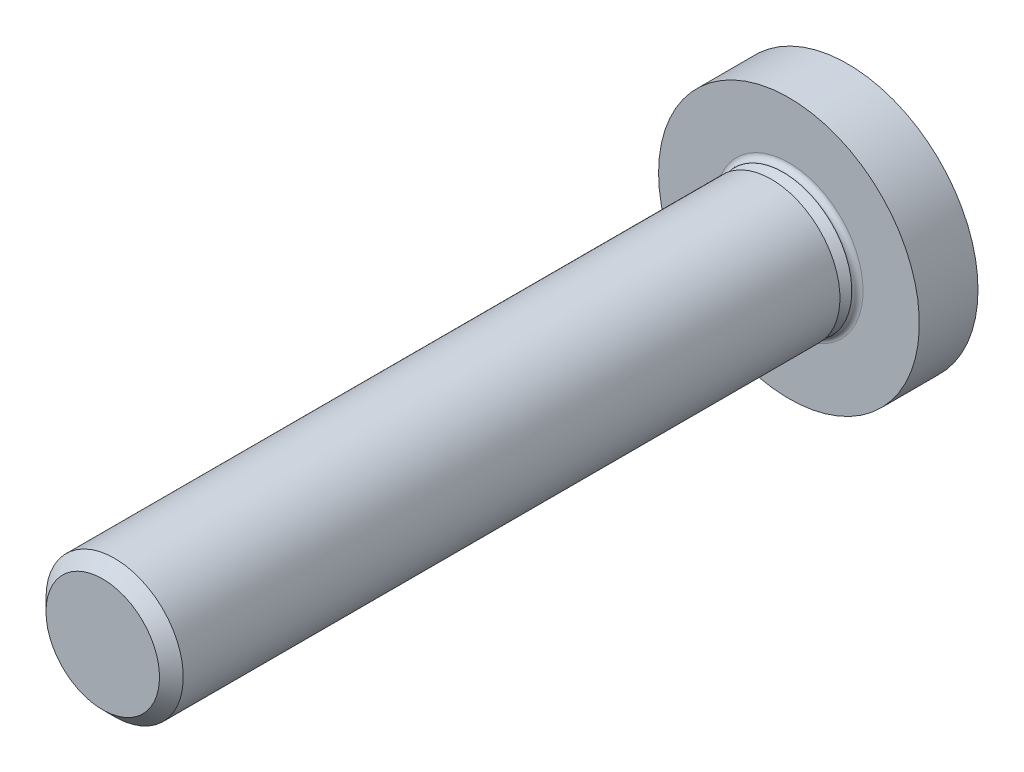
ISO-10303-21;
HEADER;
FILE_DESCRIPTION(('STEP AP214'),'2;1');
FILE_NAME('part.step','',(''),(''),'','','');
FILE_SCHEMA(('AUTOMOTIVE_DESIGN { 1 0 10303 214 1 1 1 1 }'));
ENDSEC;
DATA;
#1=APPLICATION_CONTEXT('core data for automotive mechanical design processes');
#2=APPLICATION_PROTOCOL_DEFINITION('international standard','automotive_design',2000,#1);
#3=PRODUCT_CONTEXT('',#1,'mechanical');
#4=PRODUCT('Part','Part','',(#3));
#5=PRODUCT_RELATED_PRODUCT_CATEGORY('part','',(#4));
#6=PRODUCT_DEFINITION_FORMATION('','',#4);
#7=PRODUCT_DEFINITION_CONTEXT('part definition',#1,'design');
#8=PRODUCT_DEFINITION('design','',#6,#7);
#9=PRODUCT_DEFINITION_SHAPE('','',#8);
#10=(LENGTH_UNIT() NAMED_UNIT(*) SI_UNIT(.MILLI.,.METRE.));
#11=(NAMED_UNIT(*) PLANE_ANGLE_UNIT() SI_UNIT($,.RADIAN.));
#12=(NAMED_UNIT(*) SI_UNIT($,.STERADIAN.) SOLID_ANGLE_UNIT());
#13=UNCERTAINTY_MEASURE_WITH_UNIT(LENGTH_MEASURE(1.E-05),#10,'distance_accuracy_value','');
#14=(GEOMETRIC_REPRESENTATION_CONTEXT(3) GLOBAL_UNCERTAINTY_ASSIGNED_CONTEXT((#13)) GLOBAL_UNIT_ASSIGNED_CONTEXT((#10,
#11,#12)) REPRESENTATION_CONTEXT('',''));
#15=CARTESIAN_POINT('',(0.,0.,0.));
#16=DIRECTION('',(0.,0.,1.));
#17=DIRECTION('',(1.,0.,0.));
#18=AXIS2_PLACEMENT_3D('',#15,#16,#17);
#19=CARTESIAN_POINT('',(0.,0.,8.));
#20=DIRECTION('',(0.,0.,-1.));
#21=DIRECTION('',(0.,1.,0.));
#22=AXIS2_PLACEMENT_3D('',#19,#20,#21);
#23=SPHERICAL_SURFACE('',#22,8.);
#24=CARTESIAN_POINT('',(0.,0.,1.56280340520813));
#25=DIRECTION('',(0.,0.,-1.));
#26=DIRECTION('',(-1.,0.,0.));
#27=AXIS2_PLACEMENT_3D('',#24,#25,#26);
#28=CIRCLE('',#27,4.75);
#29=CARTESIAN_POINT('',(-4.75,0.,1.56280340520814));
#30=VERTEX_POINT('',#29);
#31=EDGE_CURVE('E167',#30,#30,#28,.T.);
#32=ORIENTED_EDGE('',*,*,#31,.T.);
#33=EDGE_LOOP('',(#32));
#34=FACE_BOUND('',#33,.T.);
#35=CARTESIAN_POINT('',(-0.624137544363258,0.291040116678642,7.81547422038059));
#36=DIRECTION('',(-0.875426098065593,0.408217893676735,-0.258819045102521));
#37=DIRECTION('',(-0.422618261740699,-0.90630778703665,0.));
#38=AXIS2_PLACEMENT_3D('',#35,#36,#37);
#39=CIRCLE('',#38,7.96816780777462);
#40=CARTESIAN_POINT('',(1.03061730474433,-1.03061730474433,0.133891944403316));
#41=VERTEX_POINT('',#40);
#42=CARTESIAN_POINT('',(0.346582563727334,-2.35307070757356,0.361745044077184));
#43=VERTEX_POINT('',#42);
#44=EDGE_CURVE('E11',#41,#43,#39,.T.);
#45=ORIENTED_EDGE('',*,*,#44,.F.);
#46=CARTESIAN_POINT('',(-0.291040116678642,0.624137544363259,7.81547422038059));
#47=DIRECTION('',(-0.408217893676735,0.875426098065593,-0.258819045102521));
#48=DIRECTION('',(-0.90630778703665,-0.422618261740699,0.));
#49=AXIS2_PLACEMENT_3D('',#46,#47,#48);
#50=CIRCLE('',#49,7.96816780777462);
#51=CARTESIAN_POINT('',(2.35307070757356,-0.346582563727334,0.361745044077183));
#52=VERTEX_POINT('',#51);
#53=EDGE_CURVE('E25',#52,#41,#50,.T.);
#54=ORIENTED_EDGE('',*,*,#53,.F.);
#55=CARTESIAN_POINT('',(0.285881119635937,0.,8.07660161513776));
#56=DIRECTION('',(-0.965925826289068,0.,-0.258819045102521));
#57=DIRECTION('',(-0.258819045102521,0.,0.965925826289068));
#58=AXIS2_PLACEMENT_3D('',#55,#56,#57);
#59=CIRCLE('',#58,7.99452338654369);
#60=CARTESIAN_POINT('',(2.35307070757356,0.346582563727333,0.361745044077182));
#61=VERTEX_POINT('',#60);
#62=EDGE_CURVE('E230',#61,#52,#59,.T.);
#63=ORIENTED_EDGE('',*,*,#62,.F.);
#64=CARTESIAN_POINT('',(-0.291040116678642,-0.624137544363258,7.81547422038059));
#65=DIRECTION('',(-0.408217893676735,-0.875426098065593,-0.258819045102521));
#66=DIRECTION('',(0.90630778703665,-0.4226182617407,0.));
#67=AXIS2_PLACEMENT_3D('',#64,#65,#66);
#68=CIRCLE('',#67,7.96816780777462);
#69=CARTESIAN_POINT('',(1.03061730474433,1.03061730474433,0.133891944403315));
#70=VERTEX_POINT('',#69);
#71=EDGE_CURVE('E227',#70,#61,#68,.T.);
#72=ORIENTED_EDGE('',*,*,#71,.F.);
#73=CARTESIAN_POINT('',(-0.624137544363257,-0.291040116678642,7.81547422038059));
#74=DIRECTION('',(-0.875426098065593,-0.408217893676735,-0.258819045102521));
#75=DIRECTION('',(0.4226182617407,-0.90630778703665,0.));
#76=AXIS2_PLACEMENT_3D('',#73,#74,#75);
#77=CIRCLE('',#76,7.96816780777462);
#78=CARTESIAN_POINT('',(0.346582563727334,2.35307070757356,0.361745044077184));
#79=VERTEX_POINT('',#78);
#80=EDGE_CURVE('E224',#79,#70,#77,.T.);
#81=ORIENTED_EDGE('',*,*,#80,.F.);
#82=CARTESIAN_POINT('',(0.,0.285881119635937,8.07660161513776));
#83=DIRECTION('',(0.,-0.965925826289068,-0.258819045102521));
#84=DIRECTION('',(0.,0.258819045102521,-0.965925826289068));
#85=AXIS2_PLACEMENT_3D('',#82,#83,#84);
#86=CIRCLE('',#85,7.99452338654369);
#87=CARTESIAN_POINT('',(-0.346582563727333,2.35307070757356,0.361745044077183));
#88=VERTEX_POINT('',#87);
#89=EDGE_CURVE('E221',#88,#79,#86,.T.);
#90=ORIENTED_EDGE('',*,*,#89,.F.);
#91=CARTESIAN_POINT('',(0.624137544363259,-0.291040116678642,7.81547422038059));
#92=DIRECTION('',(0.875426098065593,-0.408217893676735,-0.258819045102521));
#93=DIRECTION('',(0.422618261740699,0.90630778703665,0.));
#94=AXIS2_PLACEMENT_3D('',#91,#92,#93);
#95=CIRCLE('',#94,7.96816780777462);
#96=CARTESIAN_POINT('',(-1.03061730474433,1.03061730474433,0.133891944403315));
#97=VERTEX_POINT('',#96);
#98=EDGE_CURVE('E218',#97,#88,#95,.T.);
#99=ORIENTED_EDGE('',*,*,#98,.F.);
#100=CARTESIAN_POINT('',(0.291040116678642,-0.624137544363258,7.81547422038059));
#101=DIRECTION('',(0.408217893676735,-0.875426098065593,-0.258819045102521));
#102=DIRECTION('',(0.90630778703665,0.422618261740699,0.));
#103=AXIS2_PLACEMENT_3D('',#100,#101,#102);
#104=CIRCLE('',#103,7.96816780777462);
#105=CARTESIAN_POINT('',(-2.35307070757356,0.346582563727334,0.361745044077184));
#106=VERTEX_POINT('',#105);
#107=EDGE_CURVE('E215',#106,#97,#104,.T.);
#108=ORIENTED_EDGE('',*,*,#107,.F.);
#109=CARTESIAN_POINT('',(-0.285881119635938,0.,8.07660161513776));
#110=DIRECTION('',(0.965925826289068,0.,-0.258819045102521));
#111=DIRECTION('',(-0.258819045102521,0.,-0.965925826289068));
#112=AXIS2_PLACEMENT_3D('',#109,#110,#111);
#113=CIRCLE('',#112,7.99452338654369);
#114=CARTESIAN_POINT('',(-2.35307070757356,-0.346582563727333,0.361745044077184));
#115=VERTEX_POINT('',#114);
#116=EDGE_CURVE('E212',#115,#106,#113,.T.);
#117=ORIENTED_EDGE('',*,*,#116,.F.);
#118=CARTESIAN_POINT('',(0.291040116678643,0.624137544363258,7.81547422038059));
#119=DIRECTION('',(0.408217893676735,0.875426098065593,-0.258819045102521));
#120=DIRECTION('',(-0.90630778703665,0.422618261740699,0.));
#121=AXIS2_PLACEMENT_3D('',#118,#119,#120);
#122=CIRCLE('',#121,7.96816780777462);
#123=CARTESIAN_POINT('',(-1.03061730474433,-1.03061730474433,0.133891944403315));
#124=VERTEX_POINT('',#123);
#125=EDGE_CURVE('E209',#124,#115,#122,.T.);
#126=ORIENTED_EDGE('',*,*,#125,.F.);
#127=CARTESIAN_POINT('',(0.624137544363258,0.291040116678642,7.81547422038059));
#128=DIRECTION('',(0.875426098065593,0.408217893676735,-0.258819045102521));
#129=DIRECTION('',(-0.422618261740699,0.90630778703665,0.));
#130=AXIS2_PLACEMENT_3D('',#127,#128,#129);
#131=CIRCLE('',#130,7.96816780777462);
#132=CARTESIAN_POINT('',(-0.346582563727334,-2.35307070757356,0.361745044077183));
#133=VERTEX_POINT('',#132);
#134=EDGE_CURVE('E206',#133,#124,#131,.T.);
#135=ORIENTED_EDGE('',*,*,#134,.F.);
#136=CARTESIAN_POINT('',(0.,-0.285881119635937,8.07660161513776));
#137=DIRECTION('',(0.,0.965925826289068,-0.258819045102521));
#138=DIRECTION('',(0.,0.258819045102521,0.965925826289068));
#139=AXIS2_PLACEMENT_3D('',#136,#137,#138);
#140=CIRCLE('',#139,7.99452338654369);
#141=EDGE_CURVE('E203',#43,#133,#140,.T.);
#142=ORIENTED_EDGE('',*,*,#141,.F.);
#143=EDGE_LOOP('',(#45,#54,#63,#72,#81,#90,#99,#108,#117,#126,#135,#142));
#144=FACE_BOUND('',#143,.T.);
#145=ADVANCED_FACE('F16',(#34,#144),#23,.T.);
#146=CARTESIAN_POINT('',(0.,0.,28.7));
#147=DIRECTION('',(0.,0.,-1.));
#148=DIRECTION('',(-1.,0.,0.));
#149=AXIS2_PLACEMENT_3D('',#146,#147,#148);
#150=PLANE('',#149);
#151=CARTESIAN_POINT('',(0.,0.,28.7));
#152=DIRECTION('',(0.,0.,-1.));
#153=DIRECTION('',(-1.,0.,0.));
#154=AXIS2_PLACEMENT_3D('',#151,#152,#153);
#155=CIRCLE('',#154,2.067);
#156=CARTESIAN_POINT('',(-2.067,0.,28.7));
#157=VERTEX_POINT('',#156);
#158=EDGE_CURVE('E199',#157,#157,#155,.T.);
#159=ORIENTED_EDGE('',*,*,#158,.F.);
#160=EDGE_LOOP('',(#159));
#161=FACE_BOUND('',#160,.T.);
#162=ADVANCED_FACE('F18',(#161),#150,.F.);
#163=CARTESIAN_POINT('',(0.,0.,28.7));
#164=DIRECTION('',(0.,0.,-1.));
#165=DIRECTION('',(-1.,0.,0.));
#166=AXIS2_PLACEMENT_3D('',#163,#164,#165);
#167=CONICAL_SURFACE('',#166,2.067,0.785398163397449);
#168=CARTESIAN_POINT('',(0.,0.,28.267));
#169=DIRECTION('',(0.,0.,-1.));
#170=DIRECTION('',(-1.,0.,0.));
#171=AXIS2_PLACEMENT_3D('',#168,#169,#170);
#172=CIRCLE('',#171,2.5);
#173=CARTESIAN_POINT('',(-2.5,0.,28.267));
#174=VERTEX_POINT('',#173);
#175=EDGE_CURVE('E195',#174,#174,#172,.T.);
#176=ORIENTED_EDGE('',*,*,#175,.F.);
#177=EDGE_LOOP('',(#176));
#178=FACE_BOUND('',#177,.T.);
#179=ORIENTED_EDGE('',*,*,#158,.T.);
#180=EDGE_LOOP('',(#179));
#181=FACE_BOUND('',#180,.T.);
#182=ADVANCED_FACE('F251',(#178,#181),#167,.T.);
#183=CARTESIAN_POINT('',(0.,0.,0.));
#184=DIRECTION('',(0.,0.,-1.));
#185=DIRECTION('',(-1.,0.,0.));
#186=AXIS2_PLACEMENT_3D('',#183,#184,#185);
#187=CYLINDRICAL_SURFACE('',#186,2.5);
#188=CARTESIAN_POINT('',(0.,0.,4.343));
#189=DIRECTION('',(0.,0.,-1.));
#190=DIRECTION('',(-1.,0.,0.));
#191=AXIS2_PLACEMENT_3D('',#188,#189,#190);
#192=CIRCLE('',#191,2.5);
#193=CARTESIAN_POINT('',(-2.5,0.,4.343));
#194=VERTEX_POINT('',#193);
#195=EDGE_CURVE('E191',#194,#194,#192,.T.);
#196=ORIENTED_EDGE('',*,*,#195,.F.);
#197=EDGE_LOOP('',(#196));
#198=FACE_BOUND('',#197,.T.);
#199=ORIENTED_EDGE('',*,*,#175,.T.);
#200=EDGE_LOOP('',(#199));
#201=FACE_BOUND('',#200,.T.);
#202=ADVANCED_FACE('F263',(#198,#201),#187,.T.);
#203=CARTESIAN_POINT('',(0.,2.5,4.343));
#204=DIRECTION('',(0.,0.,1.));
#205=DIRECTION('',(1.,0.,0.));
#206=AXIS2_PLACEMENT_3D('',#203,#204,#205);
#207=PLANE('',#206);
#208=CARTESIAN_POINT('',(0.,0.,4.343));
#209=DIRECTION('',(0.,0.,-1.));
#210=DIRECTION('',(-1.,0.,0.));
#211=AXIS2_PLACEMENT_3D('',#208,#209,#210);
#212=CIRCLE('',#211,2.067);
#213=CARTESIAN_POINT('',(-2.067,0.,4.343));
#214=VERTEX_POINT('',#213);
#215=EDGE_CURVE('E187',#214,#214,#212,.T.);
#216=ORIENTED_EDGE('',*,*,#215,.F.);
#217=EDGE_LOOP('',(#216));
#218=FACE_BOUND('',#217,.T.);
#219=ORIENTED_EDGE('',*,*,#195,.T.);
#220=EDGE_LOOP('',(#219));
#221=FACE_BOUND('',#220,.T.);
#222=ADVANCED_FACE('F273',(#218,#221),#207,.F.);
#223=CARTESIAN_POINT('',(0.,0.,4.343));
#224=DIRECTION('',(0.,0.,-1.));
#225=DIRECTION('',(-1.,0.,0.));
#226=AXIS2_PLACEMENT_3D('',#223,#224,#225);
#227=CONICAL_SURFACE('',#226,2.067,0.785398163397448);
#228=CARTESIAN_POINT('',(0.,0.,3.91));
#229=DIRECTION('',(0.,0.,-1.));
#230=DIRECTION('',(-1.,0.,0.));
#231=AXIS2_PLACEMENT_3D('',#228,#229,#230);
#232=CIRCLE('',#231,2.5);
#233=CARTESIAN_POINT('',(-2.5,0.,3.91));
#234=VERTEX_POINT('',#233);
#235=EDGE_CURVE('E183',#234,#234,#232,.T.);
#236=ORIENTED_EDGE('',*,*,#235,.F.);
#237=EDGE_LOOP('',(#236));
#238=FACE_BOUND('',#237,.T.);
#239=ORIENTED_EDGE('',*,*,#215,.T.);
#240=EDGE_LOOP('',(#239));
#241=FACE_BOUND('',#240,.T.);
#242=ADVANCED_FACE('F284',(#238,#241),#227,.T.);
#243=CARTESIAN_POINT('',(0.,0.,0.));
#244=DIRECTION('',(0.,0.,-1.));
#245=DIRECTION('',(-1.,0.,0.));
#246=AXIS2_PLACEMENT_3D('',#243,#244,#245);
#247=CYLINDRICAL_SURFACE('',#246,2.5);
#248=CARTESIAN_POINT('',(0.,0.,3.9));
#249=DIRECTION('',(0.,0.,-1.));
#250=DIRECTION('',(-1.,0.,0.));
#251=AXIS2_PLACEMENT_3D('',#248,#249,#250);
#252=CIRCLE('',#251,2.5);
#253=CARTESIAN_POINT('',(-2.5,0.,3.9));
#254=VERTEX_POINT('',#253);
#255=EDGE_CURVE('E179',#254,#254,#252,.T.);
#256=ORIENTED_EDGE('',*,*,#255,.F.);
#257=EDGE_LOOP('',(#256));
#258=FACE_BOUND('',#257,.T.);
#259=ORIENTED_EDGE('',*,*,#235,.T.);
#260=EDGE_LOOP('',(#259));
#261=FACE_BOUND('',#260,.T.);
#262=ADVANCED_FACE('F295',(#258,#261),#247,.T.);
#263=CARTESIAN_POINT('',(0.,0.,3.9));
#264=DIRECTION('',(0.,0.,-1.));
#265=DIRECTION('',(-1.,0.,0.));
#266=AXIS2_PLACEMENT_3D('',#263,#264,#265);
#267=TOROIDAL_SURFACE('',#266,2.7,0.2);
#268=ORIENTED_EDGE('',*,*,#255,.T.);
#269=EDGE_LOOP('',(#268));
#270=FACE_BOUND('',#269,.T.);
#271=CARTESIAN_POINT('',(0.,0.,3.7));
#272=DIRECTION('',(0.,0.,-1.));
#273=DIRECTION('',(-1.,0.,0.));
#274=AXIS2_PLACEMENT_3D('',#271,#272,#273);
#275=CIRCLE('',#274,2.7);
#276=CARTESIAN_POINT('',(-2.7,0.,3.7));
#277=VERTEX_POINT('',#276);
#278=EDGE_CURVE('E175',#277,#277,#275,.T.);
#279=ORIENTED_EDGE('',*,*,#278,.F.);
#280=EDGE_LOOP('',(#279));
#281=FACE_BOUND('',#280,.T.);
#282=ADVANCED_FACE('F306',(#270,#281),#267,.F.);
#283=CARTESIAN_POINT('',(0.,2.7,3.7));
#284=DIRECTION('',(0.,0.,-1.));
#285=DIRECTION('',(-1.,0.,0.));
#286=AXIS2_PLACEMENT_3D('',#283,#284,#285);
#287=PLANE('',#286);
#288=CARTESIAN_POINT('',(0.,0.,3.7));
#289=DIRECTION('',(0.,0.,-1.));
#290=DIRECTION('',(-1.,0.,0.));
#291=AXIS2_PLACEMENT_3D('',#288,#289,#290);
#292=CIRCLE('',#291,4.75);
#293=CARTESIAN_POINT('',(-4.75,0.,3.7));
#294=VERTEX_POINT('',#293);
#295=EDGE_CURVE('E171',#294,#294,#292,.T.);
#296=ORIENTED_EDGE('',*,*,#295,.F.);
#297=EDGE_LOOP('',(#296));
#298=FACE_BOUND('',#297,.T.);
#299=ORIENTED_EDGE('',*,*,#278,.T.);
#300=EDGE_LOOP('',(#299));
#301=FACE_BOUND('',#300,.T.);
#302=ADVANCED_FACE('F317',(#298,#301),#287,.F.);
#303=CARTESIAN_POINT('',(0.,0.,0.));
#304=DIRECTION('',(0.,0.,-1.));
#305=DIRECTION('',(-1.,0.,0.));
#306=AXIS2_PLACEMENT_3D('',#303,#304,#305);
#307=CYLINDRICAL_SURFACE('',#306,4.75);
#308=ORIENTED_EDGE('',*,*,#31,.F.);
#309=EDGE_LOOP('',(#308));
#310=FACE_BOUND('',#309,.T.);
#311=ORIENTED_EDGE('',*,*,#295,.T.);
#312=EDGE_LOOP('',(#311));
#313=FACE_BOUND('',#312,.T.);
#314=ADVANCED_FACE('F328',(#310,#313),#307,.T.);
#315=CARTESIAN_POINT('',(0.408333333333333,-2.45,0.));
#316=DIRECTION('',(-0.875426098065593,0.408217893676735,-0.258819045102521));
#317=DIRECTION('',(-0.422618261740699,-0.90630778703665,0.));
#318=AXIS2_PLACEMENT_3D('',#315,#316,#317);
#319=PLANE('',#318);
#320=ORIENTED_EDGE('',*,*,#44,.T.);
#321=DIRECTION('',(0.162689201767992,-0.255370893567974,-0.953057149569945));
#322=VECTOR('',#321,1.);
#323=CARTESIAN_POINT('',(0.408333333333333,-2.45,0.));
#324=LINE('',#323,#322);
#325=CARTESIAN_POINT('',(0.,-1.80904505601036,2.39207641633181));
#326=VERTEX_POINT('',#325);
#327=EDGE_CURVE('E32',#326,#43,#324,.T.);
#328=ORIENTED_EDGE('',*,*,#327,.F.);
#329=DIRECTION('',(0.,-0.535467009821226,-0.844556144606808));
#330=VECTOR('',#329,1.);
#331=CARTESIAN_POINT('',(0.,-3.07459620054544,0.396007609425984));
#332=LINE('',#331,#330);
#333=CARTESIAN_POINT('',(0.,-1.80402133120418,2.4));
#334=VERTEX_POINT('',#333);
#335=EDGE_CURVE('E111',#334,#326,#332,.T.);
#336=ORIENTED_EDGE('',*,*,#335,.F.);
#337=DIRECTION('',(0.422618261740699,0.90630778703665,0.));
#338=VECTOR('',#337,1.);
#339=CARTESIAN_POINT('',(0.0969943394144161,-1.59601629907971,2.4));
#340=LINE('',#339,#338);
#341=CARTESIAN_POINT('',(0.573705632332283,-0.573705632332282,2.4));
#342=VERTEX_POINT('',#341);
#343=EDGE_CURVE('E106',#334,#342,#340,.T.);
#344=ORIENTED_EDGE('',*,*,#343,.T.);
#345=DIRECTION('',(0.193899607686987,-0.193899607686987,-0.961668281829896));
#346=VECTOR('',#345,1.);
#347=CARTESIAN_POINT('',(1.08555231451638,-1.08555231451638,-0.138564803137273));
#348=LINE('',#347,#346);
#349=EDGE_CURVE('E109',#342,#41,#348,.T.);
#350=ORIENTED_EDGE('',*,*,#349,.T.);
#351=EDGE_LOOP('',(#320,#328,#336,#344,#350));
#352=FACE_BOUND('',#351,.T.);
#353=ADVANCED_FACE('F108',(#352),#319,.T.);
#354=CARTESIAN_POINT('',(1.05761371918659,-1.05761371918658,0.));
#355=DIRECTION('',(-0.408217893676735,0.875426098065593,-0.258819045102521));
#356=DIRECTION('',(-0.90630778703665,-0.422618261740699,0.));
#357=AXIS2_PLACEMENT_3D('',#354,#355,#356);
#358=PLANE('',#357);
#359=ORIENTED_EDGE('',*,*,#53,.T.);
#360=ORIENTED_EDGE('',*,*,#349,.F.);
#361=DIRECTION('',(0.90630778703665,0.422618261740699,0.));
#362=VECTOR('',#361,1.);
#363=CARTESIAN_POINT('',(0.165203979430989,-0.764193081449131,2.4));
#364=LINE('',#363,#362);
#365=CARTESIAN_POINT('',(1.80402133120418,0.,2.4));
#366=VERTEX_POINT('',#365);
#367=EDGE_CURVE('E116',#342,#366,#364,.T.);
#368=ORIENTED_EDGE('',*,*,#367,.T.);
#369=DIRECTION('',(0.535467009821226,0.,-0.844556144606808));
#370=VECTOR('',#369,1.);
#371=CARTESIAN_POINT('',(3.07459620054544,0.,0.396007609425983));
#372=LINE('',#371,#370);
#373=CARTESIAN_POINT('',(1.80904505601036,0.,2.39207641633181));
#374=VERTEX_POINT('',#373);
#375=EDGE_CURVE('E133',#366,#374,#372,.T.);
#376=ORIENTED_EDGE('',*,*,#375,.T.);
#377=DIRECTION('',(0.255370893567974,-0.162689201767992,-0.953057149569945));
#378=VECTOR('',#377,1.);
#379=CARTESIAN_POINT('',(2.45,-0.408333333333333,0.));
#380=LINE('',#379,#378);
#381=EDGE_CURVE('E127',#374,#52,#380,.T.);
#382=ORIENTED_EDGE('',*,*,#381,.T.);
#383=EDGE_LOOP('',(#359,#360,#368,#376,#382));
#384=FACE_BOUND('',#383,.T.);
#385=ADVANCED_FACE('F125',(#384),#358,.T.);
#386=CARTESIAN_POINT('',(2.45,-0.408333333333333,0.));
#387=DIRECTION('',(-0.965925826289068,0.,-0.258819045102521));
#388=DIRECTION('',(-0.258819045102521,0.,0.965925826289068));
#389=AXIS2_PLACEMENT_3D('',#386,#387,#388);
#390=PLANE('',#389);
#391=ORIENTED_EDGE('',*,*,#62,.T.);
#392=ORIENTED_EDGE('',*,*,#381,.F.);
#393=DIRECTION('',(0.255370893567974,0.162689201767992,-0.953057149569945));
#394=VECTOR('',#393,1.);
#395=CARTESIAN_POINT('',(2.45,0.408333333333333,0.));
#396=LINE('',#395,#394);
#397=EDGE_CURVE('E136',#374,#61,#396,.T.);
#398=ORIENTED_EDGE('',*,*,#397,.T.);
#399=EDGE_LOOP('',(#391,#392,#398));
#400=FACE_BOUND('',#399,.T.);
#401=ADVANCED_FACE('F399',(#400),#390,.T.);
#402=CARTESIAN_POINT('',(2.45,0.408333333333333,0.));
#403=DIRECTION('',(-0.408217893676735,-0.875426098065593,-0.258819045102521));
#404=DIRECTION('',(0.90630778703665,-0.4226182617407,0.));
#405=AXIS2_PLACEMENT_3D('',#402,#403,#404);
#406=PLANE('',#405);
#407=ORIENTED_EDGE('',*,*,#71,.T.);
#408=ORIENTED_EDGE('',*,*,#397,.F.);
#409=ORIENTED_EDGE('',*,*,#375,.F.);
#410=DIRECTION('',(-0.90630778703665,0.4226182617407,0.));
#411=VECTOR('',#410,1.);
#412=CARTESIAN_POINT('',(1.59601629907971,0.0969943394144154,2.4));
#413=LINE('',#412,#411);
#414=CARTESIAN_POINT('',(0.573705632332284,0.573705632332283,2.4));
#415=VERTEX_POINT('',#414);
#416=EDGE_CURVE('E122',#366,#415,#413,.T.);
#417=ORIENTED_EDGE('',*,*,#416,.T.);
#418=DIRECTION('',(0.193899607686987,0.193899607686987,-0.961668281829896));
#419=VECTOR('',#418,1.);
#420=CARTESIAN_POINT('',(1.08555231451638,1.08555231451638,-0.138564803137272));
#421=LINE('',#420,#419);
#422=EDGE_CURVE('E387',#415,#70,#421,.T.);
#423=ORIENTED_EDGE('',*,*,#422,.T.);
#424=EDGE_LOOP('',(#407,#408,#409,#417,#423));
#425=FACE_BOUND('',#424,.T.);
#426=ADVANCED_FACE('F432',(#425),#406,.T.);
#427=CARTESIAN_POINT('',(1.05761371918659,1.05761371918658,0.));
#428=DIRECTION('',(-0.875426098065593,-0.408217893676735,-0.258819045102521));
#429=DIRECTION('',(0.4226182617407,-0.90630778703665,0.));
#430=AXIS2_PLACEMENT_3D('',#427,#428,#429);
#431=PLANE('',#430);
#432=ORIENTED_EDGE('',*,*,#80,.T.);
#433=ORIENTED_EDGE('',*,*,#422,.F.);
#434=DIRECTION('',(-0.4226182617407,0.90630778703665,0.));
#435=VECTOR('',#434,1.);
#436=CARTESIAN_POINT('',(1.52780665906313,-1.4723706223573,2.4));
#437=LINE('',#436,#435);
#438=CARTESIAN_POINT('',(0.,1.80402133120418,2.4));
#439=VERTEX_POINT('',#438);
#440=EDGE_CURVE('E142',#415,#439,#437,.T.);
#441=ORIENTED_EDGE('',*,*,#440,.T.);
#442=DIRECTION('',(0.,0.535467009821226,-0.844556144606808));
#443=VECTOR('',#442,1.);
#444=CARTESIAN_POINT('',(0.,3.07459620054544,0.396007609425984));
#445=LINE('',#444,#443);
#446=CARTESIAN_POINT('',(0.,1.80904505601036,2.39207641633181));
#447=VERTEX_POINT('',#446);
#448=EDGE_CURVE('E161',#439,#447,#445,.T.);
#449=ORIENTED_EDGE('',*,*,#448,.T.);
#450=DIRECTION('',(0.162689201767992,0.255370893567974,-0.953057149569945));
#451=VECTOR('',#450,1.);
#452=CARTESIAN_POINT('',(0.408333333333334,2.45,0.));
#453=LINE('',#452,#451);
#454=EDGE_CURVE('E383',#447,#79,#453,.T.);
#455=ORIENTED_EDGE('',*,*,#454,.T.);
#456=EDGE_LOOP('',(#432,#433,#441,#449,#455));
#457=FACE_BOUND('',#456,.T.);
#458=ADVANCED_FACE('F430',(#457),#431,.T.);
#459=CARTESIAN_POINT('',(0.408333333333334,2.45,0.));
#460=DIRECTION('',(0.,-0.965925826289068,-0.258819045102521));
#461=DIRECTION('',(0.,0.258819045102521,-0.965925826289068));
#462=AXIS2_PLACEMENT_3D('',#459,#460,#461);
#463=PLANE('',#462);
#464=ORIENTED_EDGE('',*,*,#89,.T.);
#465=ORIENTED_EDGE('',*,*,#454,.F.);
#466=DIRECTION('',(-0.162689201767992,0.255370893567974,-0.953057149569945));
#467=VECTOR('',#466,1.);
#468=CARTESIAN_POINT('',(-0.408333333333333,2.45,0.));
#469=LINE('',#468,#467);
#470=EDGE_CURVE('E379',#447,#88,#469,.T.);
#471=ORIENTED_EDGE('',*,*,#470,.T.);
#472=EDGE_LOOP('',(#464,#465,#471));
#473=FACE_BOUND('',#472,.T.);
#474=ADVANCED_FACE('F428',(#473),#463,.T.);
#475=CARTESIAN_POINT('',(-0.408333333333333,2.45,0.));
#476=DIRECTION('',(0.875426098065593,-0.408217893676735,-0.258819045102521));
#477=DIRECTION('',(0.422618261740699,0.90630778703665,0.));
#478=AXIS2_PLACEMENT_3D('',#475,#476,#477);
#479=PLANE('',#478);
#480=ORIENTED_EDGE('',*,*,#98,.T.);
#481=ORIENTED_EDGE('',*,*,#470,.F.);
#482=ORIENTED_EDGE('',*,*,#448,.F.);
#483=DIRECTION('',(-0.422618261740699,-0.90630778703665,0.));
#484=VECTOR('',#483,1.);
#485=CARTESIAN_POINT('',(-1.28496617662264,-0.951597527183794,2.4));
#486=LINE('',#485,#484);
#487=CARTESIAN_POINT('',(-0.573705632332282,0.573705632332284,2.4));
#488=VERTEX_POINT('',#487);
#489=EDGE_CURVE('E146',#439,#488,#486,.T.);
#490=ORIENTED_EDGE('',*,*,#489,.T.);
#491=DIRECTION('',(-0.193899607686987,0.193899607686987,-0.961668281829896));
#492=VECTOR('',#491,1.);
#493=CARTESIAN_POINT('',(-1.08555231451638,1.08555231451638,-0.138564803137273));
#494=LINE('',#493,#492);
#495=EDGE_CURVE('E375',#488,#97,#494,.T.);
#496=ORIENTED_EDGE('',*,*,#495,.T.);
#497=EDGE_LOOP('',(#480,#481,#482,#490,#496));
#498=FACE_BOUND('',#497,.T.);
#499=ADVANCED_FACE('F422',(#498),#479,.T.);
#500=CARTESIAN_POINT('',(-1.05761371918658,1.05761371918659,0.));
#501=DIRECTION('',(0.408217893676735,-0.875426098065593,-0.258819045102521));
#502=DIRECTION('',(0.90630778703665,0.422618261740699,0.));
#503=AXIS2_PLACEMENT_3D('',#500,#501,#502);
#504=PLANE('',#503);
#505=ORIENTED_EDGE('',*,*,#107,.T.);
#506=ORIENTED_EDGE('',*,*,#495,.F.);
#507=DIRECTION('',(-0.90630778703665,-0.422618261740699,0.));
#508=VECTOR('',#507,1.);
#509=CARTESIAN_POINT('',(-0.479214792464927,0.617767434587929,2.4));
#510=LINE('',#509,#508);
#511=CARTESIAN_POINT('',(-1.80402133120418,0.,2.4));
#512=VERTEX_POINT('',#511);
#513=EDGE_CURVE('E149',#488,#512,#510,.T.);
#514=ORIENTED_EDGE('',*,*,#513,.T.);
#515=DIRECTION('',(-0.535467009821226,0.,-0.844556144606808));
#516=VECTOR('',#515,1.);
#517=CARTESIAN_POINT('',(-3.07459620054544,0.,0.396007609425984));
#518=LINE('',#517,#516);
#519=CARTESIAN_POINT('',(-1.80904505601036,0.,2.39207641633181));
#520=VERTEX_POINT('',#519);
#521=EDGE_CURVE('E164',#512,#520,#518,.T.);
#522=ORIENTED_EDGE('',*,*,#521,.T.);
#523=DIRECTION('',(-0.255370893567974,0.162689201767992,-0.953057149569945));
#524=VECTOR('',#523,1.);
#525=CARTESIAN_POINT('',(-2.45,0.408333333333333,0.));
#526=LINE('',#525,#524);
#527=EDGE_CURVE('E371',#520,#106,#526,.T.);
#528=ORIENTED_EDGE('',*,*,#527,.T.);
#529=EDGE_LOOP('',(#505,#506,#514,#522,#528));
#530=FACE_BOUND('',#529,.T.);
#531=ADVANCED_FACE('F417',(#530),#504,.T.);
#532=CARTESIAN_POINT('',(-2.45,0.408333333333333,0.));
#533=DIRECTION('',(0.965925826289068,0.,-0.258819045102521));
#534=DIRECTION('',(-0.258819045102521,0.,-0.965925826289068));
#535=AXIS2_PLACEMENT_3D('',#532,#533,#534);
#536=PLANE('',#535);
#537=ORIENTED_EDGE('',*,*,#116,.T.);
#538=ORIENTED_EDGE('',*,*,#527,.F.);
#539=DIRECTION('',(-0.255370893567974,-0.162689201767992,-0.953057149569945));
#540=VECTOR('',#539,1.);
#541=CARTESIAN_POINT('',(-2.45,-0.408333333333333,0.));
#542=LINE('',#541,#540);
#543=EDGE_CURVE('E367',#520,#115,#542,.T.);
#544=ORIENTED_EDGE('',*,*,#543,.T.);
#545=EDGE_LOOP('',(#537,#538,#544));
#546=FACE_BOUND('',#545,.T.);
#547=ADVANCED_FACE('F497',(#546),#536,.T.);
#548=CARTESIAN_POINT('',(-2.45,-0.408333333333333,0.));
#549=DIRECTION('',(0.408217893676735,0.875426098065593,-0.258819045102521));
#550=DIRECTION('',(-0.90630778703665,0.422618261740699,0.));
#551=AXIS2_PLACEMENT_3D('',#548,#549,#550);
#552=PLANE('',#551);
#553=ORIENTED_EDGE('',*,*,#125,.T.);
#554=ORIENTED_EDGE('',*,*,#543,.F.);
#555=ORIENTED_EDGE('',*,*,#521,.F.);
#556=DIRECTION('',(0.90630778703665,-0.422618261740699,0.));
#557=VECTOR('',#556,1.);
#558=CARTESIAN_POINT('',(0.951597527183793,-1.28496617662264,2.4));
#559=LINE('',#558,#557);
#560=CARTESIAN_POINT('',(-0.573705632332284,-0.573705632332282,2.4));
#561=VERTEX_POINT('',#560);
#562=EDGE_CURVE('E153',#512,#561,#559,.T.);
#563=ORIENTED_EDGE('',*,*,#562,.T.);
#564=DIRECTION('',(-0.193899607686987,-0.193899607686987,-0.961668281829896));
#565=VECTOR('',#564,1.);
#566=CARTESIAN_POINT('',(-1.08555231451638,-1.08555231451638,-0.138564803137273));
#567=LINE('',#566,#565);
#568=EDGE_CURVE('E361',#561,#124,#567,.T.);
#569=ORIENTED_EDGE('',*,*,#568,.T.);
#570=EDGE_LOOP('',(#553,#554,#555,#563,#569));
#571=FACE_BOUND('',#570,.T.);
#572=ADVANCED_FACE('F507',(#571),#552,.T.);
#573=CARTESIAN_POINT('',(-1.05761371918659,-1.05761371918658,0.));
#574=DIRECTION('',(0.875426098065593,0.408217893676735,-0.258819045102521));
#575=DIRECTION('',(-0.422618261740699,0.90630778703665,0.));
#576=AXIS2_PLACEMENT_3D('',#573,#574,#575);
#577=PLANE('',#576);
#578=ORIENTED_EDGE('',*,*,#134,.T.);
#579=ORIENTED_EDGE('',*,*,#568,.F.);
#580=DIRECTION('',(0.422618261740699,-0.90630778703665,0.));
#581=VECTOR('',#580,1.);
#582=CARTESIAN_POINT('',(0.145846143026075,-2.11678939425322,2.4));
#583=LINE('',#582,#581);
#584=EDGE_CURVE('E156',#561,#334,#583,.T.);
#585=ORIENTED_EDGE('',*,*,#584,.T.);
#586=ORIENTED_EDGE('',*,*,#335,.T.);
#587=DIRECTION('',(-0.162689201767992,-0.255370893567974,-0.953057149569945));
#588=VECTOR('',#587,1.);
#589=CARTESIAN_POINT('',(-0.408333333333333,-2.45,0.));
#590=LINE('',#589,#588);
#591=EDGE_CURVE('E355',#326,#133,#590,.T.);
#592=ORIENTED_EDGE('',*,*,#591,.T.);
#593=EDGE_LOOP('',(#578,#579,#585,#586,#592));
#594=FACE_BOUND('',#593,.T.);
#595=ADVANCED_FACE('F409',(#594),#577,.T.);
#596=CARTESIAN_POINT('',(-0.408333333333333,-2.45,0.));
#597=DIRECTION('',(0.,0.965925826289068,-0.258819045102521));
#598=DIRECTION('',(0.,0.258819045102521,0.965925826289068));
#599=AXIS2_PLACEMENT_3D('',#596,#597,#598);
#600=PLANE('',#599);
#601=ORIENTED_EDGE('',*,*,#141,.T.);
#602=ORIENTED_EDGE('',*,*,#591,.F.);
#603=ORIENTED_EDGE('',*,*,#327,.T.);
#604=EDGE_LOOP('',(#601,#602,#603));
#605=FACE_BOUND('',#604,.T.);
#606=ADVANCED_FACE('F407',(#605),#600,.T.);
#607=CARTESIAN_POINT('',(0.679820994527636,-1.86779283173586,2.4));
#608=DIRECTION('',(0.,0.,-1.));
#609=DIRECTION('',(-1.,0.,0.));
#610=AXIS2_PLACEMENT_3D('',#607,#608,#609);
#611=PLANE('',#610);
#612=ORIENTED_EDGE('',*,*,#584,.F.);
#613=ORIENTED_EDGE('',*,*,#562,.F.);
#614=ORIENTED_EDGE('',*,*,#513,.F.);
#615=ORIENTED_EDGE('',*,*,#489,.F.);
#616=ORIENTED_EDGE('',*,*,#440,.F.);
#617=ORIENTED_EDGE('',*,*,#416,.F.);
#618=ORIENTED_EDGE('',*,*,#367,.F.);
#619=ORIENTED_EDGE('',*,*,#343,.F.);
#620=EDGE_LOOP('',(#612,#613,#614,#615,#616,#617,#618,#619));
#621=FACE_BOUND('',#620,.T.);
#622=ADVANCED_FACE('F120',(#621),#611,.T.);
#623=CLOSED_SHELL('',(#145,#162,#182,#202,#222,#242,#262,#282,#302,#314,#353,#385,#401,#426,
#458,#474,#499,#531,#547,#572,#595,#606,#622));
#624=MANIFOLD_SOLID_BREP('B1',#623);
#625=ADVANCED_BREP_SHAPE_REPRESENTATION('',(#18,#624),#14);
#626=SHAPE_DEFINITION_REPRESENTATION(#9,#625);
ENDSEC;
END-ISO-10303-21;
